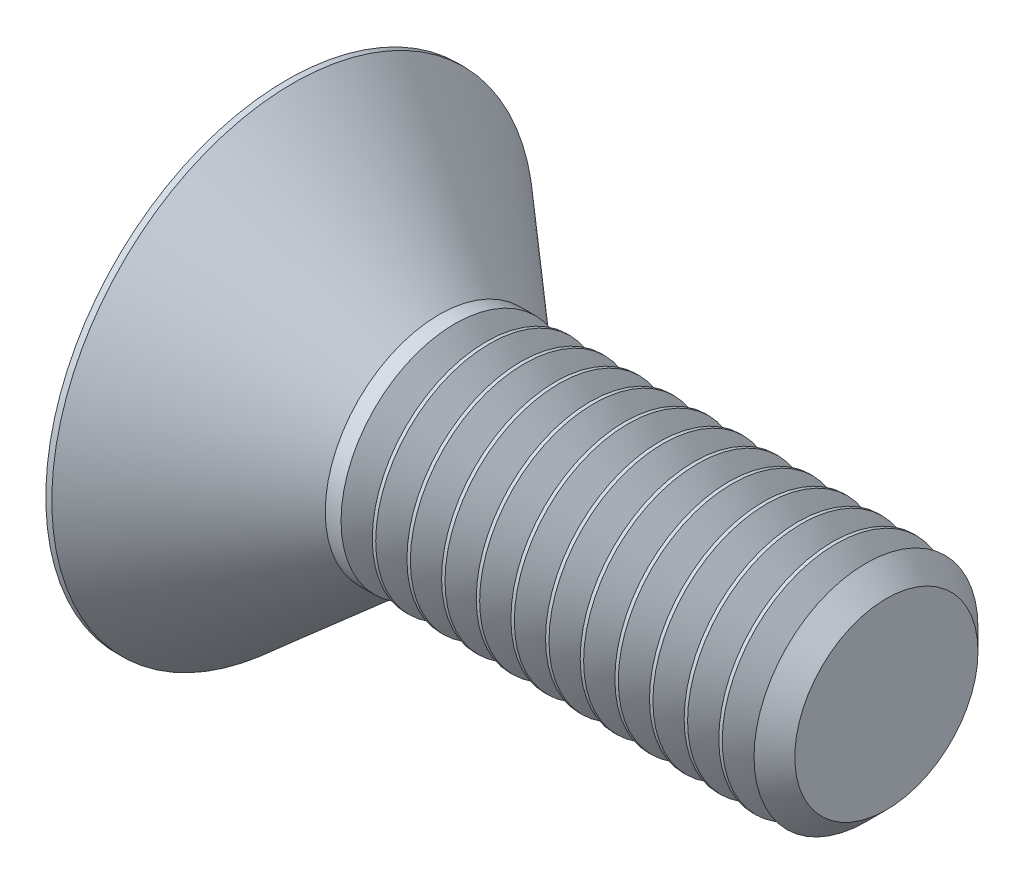
ISO-10303-21;
HEADER;
FILE_DESCRIPTION(('STEP AP214'),'2;1');
FILE_NAME('part.step','',(''),(''),'','','');
FILE_SCHEMA(('AUTOMOTIVE_DESIGN { 1 0 10303 214 1 1 1 1 }'));
ENDSEC;
DATA;
#1=APPLICATION_CONTEXT('core data for automotive mechanical design processes');
#2=APPLICATION_PROTOCOL_DEFINITION('international standard','automotive_design',2000,#1);
#3=PRODUCT_CONTEXT('',#1,'mechanical');
#4=PRODUCT('Part','Part','',(#3));
#5=PRODUCT_RELATED_PRODUCT_CATEGORY('part','',(#4));
#6=PRODUCT_DEFINITION_FORMATION('','',#4);
#7=PRODUCT_DEFINITION_CONTEXT('part definition',#1,'design');
#8=PRODUCT_DEFINITION('design','',#6,#7);
#9=PRODUCT_DEFINITION_SHAPE('','',#8);
#10=(LENGTH_UNIT() NAMED_UNIT(*) SI_UNIT(.MILLI.,.METRE.));
#11=(NAMED_UNIT(*) PLANE_ANGLE_UNIT() SI_UNIT($,.RADIAN.));
#12=(NAMED_UNIT(*) SI_UNIT($,.STERADIAN.) SOLID_ANGLE_UNIT());
#13=UNCERTAINTY_MEASURE_WITH_UNIT(LENGTH_MEASURE(1.E-05),#10,'distance_accuracy_value','');
#14=(GEOMETRIC_REPRESENTATION_CONTEXT(3) GLOBAL_UNCERTAINTY_ASSIGNED_CONTEXT((#13)) GLOBAL_UNIT_ASSIGNED_CONTEXT((#10,
#11,#12)) REPRESENTATION_CONTEXT('',''));
#15=CARTESIAN_POINT('',(0.,0.,0.));
#16=DIRECTION('',(0.,0.,1.));
#17=DIRECTION('',(1.,0.,0.));
#18=AXIS2_PLACEMENT_3D('',#15,#16,#17);
#19=CARTESIAN_POINT('',(2.2098,0.,0.));
#20=DIRECTION('',(-1.,0.,0.));
#21=DIRECTION('',(0.,0.,1.));
#22=AXIS2_PLACEMENT_3D('',#19,#20,#21);
#23=PLANE('',#22);
#24=DIRECTION('',(0.,-1.,0.));
#25=VECTOR('',#24,1.);
#26=CARTESIAN_POINT('',(2.2098,0.916543552338531,-1.5875));
#27=LINE('',#26,#25);
#28=CARTESIAN_POINT('',(2.2098,0.916543552338531,-1.5875));
#29=VERTEX_POINT('',#28);
#30=CARTESIAN_POINT('',(2.20980000040584,0.,-1.5875));
#31=VERTEX_POINT('',#30);
#32=EDGE_CURVE('E157',#29,#31,#27,.T.);
#33=ORIENTED_EDGE('',*,*,#32,.T.);
#34=CARTESIAN_POINT('',(2.20980000040584,0.,0.));
#35=DIRECTION('',(1.,0.,0.));
#36=DIRECTION('',(0.,0.,-1.));
#37=AXIS2_PLACEMENT_3D('',#34,#35,#36);
#38=CIRCLE('',#37,1.58750000019488);
#39=CARTESIAN_POINT('',(2.20980000040584,1.37481532867657,-0.793750000097439));
#40=VERTEX_POINT('',#39);
#41=EDGE_CURVE('E46',#31,#40,#38,.T.);
#42=ORIENTED_EDGE('',*,*,#41,.T.);
#43=DIRECTION('',(0.,-0.5,-0.866025403784439));
#44=VECTOR('',#43,1.);
#45=CARTESIAN_POINT('',(2.2098,1.83308710467706,0.));
#46=LINE('',#45,#44);
#47=EDGE_CURVE('E319',#40,#29,#46,.T.);
#48=ORIENTED_EDGE('',*,*,#47,.T.);
#49=EDGE_LOOP('',(#33,#42,#48));
#50=FACE_BOUND('',#49,.T.);
#51=ADVANCED_FACE('F35',(#50),#23,.T.);
#52=CARTESIAN_POINT('',(2.2098,1.83308710467706,0.));
#53=VERTEX_POINT('',#52);
#54=EDGE_CURVE('E324',#53,#40,#46,.T.);
#55=ORIENTED_EDGE('',*,*,#54,.T.);
#56=CARTESIAN_POINT('',(2.20980000040584,1.37481532867657,0.793750000097439));
#57=VERTEX_POINT('',#56);
#58=EDGE_CURVE('E11',#40,#57,#38,.T.);
#59=ORIENTED_EDGE('',*,*,#58,.T.);
#60=DIRECTION('',(0.,0.5,-0.866025403784439));
#61=VECTOR('',#60,1.);
#62=CARTESIAN_POINT('',(2.2098,0.916543552338531,1.5875));
#63=LINE('',#62,#61);
#64=EDGE_CURVE('E183',#57,#53,#63,.T.);
#65=ORIENTED_EDGE('',*,*,#64,.T.);
#66=EDGE_LOOP('',(#55,#59,#65));
#67=FACE_BOUND('',#66,.T.);
#68=ADVANCED_FACE('F122',(#67),#23,.T.);
#69=CARTESIAN_POINT('',(2.2098,0.916543552338531,1.5875));
#70=VERTEX_POINT('',#69);
#71=EDGE_CURVE('E325',#70,#57,#63,.T.);
#72=ORIENTED_EDGE('',*,*,#71,.T.);
#73=CARTESIAN_POINT('',(2.20980000040584,0.,1.58750000019488));
#74=VERTEX_POINT('',#73);
#75=EDGE_CURVE('E44',#57,#74,#38,.T.);
#76=ORIENTED_EDGE('',*,*,#75,.T.);
#77=DIRECTION('',(0.,1.,0.));
#78=VECTOR('',#77,1.);
#79=CARTESIAN_POINT('',(2.2098,-0.91654355233853,1.5875));
#80=LINE('',#79,#78);
#81=EDGE_CURVE('E162',#74,#70,#80,.T.);
#82=ORIENTED_EDGE('',*,*,#81,.T.);
#83=EDGE_LOOP('',(#72,#76,#82));
#84=FACE_BOUND('',#83,.T.);
#85=ADVANCED_FACE('F128',(#84),#23,.T.);
#86=CARTESIAN_POINT('',(2.2098,-0.91654355233853,1.5875));
#87=VERTEX_POINT('',#86);
#88=EDGE_CURVE('E163',#87,#74,#80,.T.);
#89=ORIENTED_EDGE('',*,*,#88,.T.);
#90=CARTESIAN_POINT('',(2.20980000040584,-1.37481532867657,0.793750000097439));
#91=VERTEX_POINT('',#90);
#92=EDGE_CURVE('E316',#74,#91,#38,.T.);
#93=ORIENTED_EDGE('',*,*,#92,.T.);
#94=DIRECTION('',(0.,0.5,0.866025403784439));
#95=VECTOR('',#94,1.);
#96=CARTESIAN_POINT('',(2.2098,-1.83308710467706,0.));
#97=LINE('',#96,#95);
#98=EDGE_CURVE('E152',#91,#87,#97,.T.);
#99=ORIENTED_EDGE('',*,*,#98,.T.);
#100=EDGE_LOOP('',(#89,#93,#99));
#101=FACE_BOUND('',#100,.T.);
#102=ADVANCED_FACE('F141',(#101),#23,.T.);
#103=CARTESIAN_POINT('',(2.2098,-1.83308710467706,0.));
#104=VERTEX_POINT('',#103);
#105=EDGE_CURVE('E155',#104,#91,#97,.T.);
#106=ORIENTED_EDGE('',*,*,#105,.T.);
#107=CARTESIAN_POINT('',(2.20980000040584,-1.37481532867657,-0.793750000097439));
#108=VERTEX_POINT('',#107);
#109=EDGE_CURVE('E314',#91,#108,#38,.T.);
#110=ORIENTED_EDGE('',*,*,#109,.T.);
#111=DIRECTION('',(0.,-0.5,0.866025403784439));
#112=VECTOR('',#111,1.);
#113=CARTESIAN_POINT('',(2.2098,-0.91654355233853,-1.5875));
#114=LINE('',#113,#112);
#115=EDGE_CURVE('E153',#108,#104,#114,.T.);
#116=ORIENTED_EDGE('',*,*,#115,.T.);
#117=EDGE_LOOP('',(#106,#110,#116));
#118=FACE_BOUND('',#117,.T.);
#119=ADVANCED_FACE('F133',(#118),#23,.T.);
#120=CARTESIAN_POINT('',(2.2098,-0.91654355233853,-1.5875));
#121=VERTEX_POINT('',#120);
#122=EDGE_CURVE('E145',#121,#108,#114,.T.);
#123=ORIENTED_EDGE('',*,*,#122,.T.);
#124=EDGE_CURVE('E146',#108,#31,#38,.T.);
#125=ORIENTED_EDGE('',*,*,#124,.T.);
#126=EDGE_CURVE('E148',#31,#121,#27,.T.);
#127=ORIENTED_EDGE('',*,*,#126,.T.);
#128=EDGE_LOOP('',(#123,#125,#127));
#129=FACE_BOUND('',#128,.T.);
#130=ADVANCED_FACE('F124',(#129),#23,.T.);
#131=CARTESIAN_POINT('',(0.,6.68201751571258E-11,0.));
#132=DIRECTION('',(1.,0.,0.));
#133=DIRECTION('',(0.,0.,-1.));
#134=AXIS2_PLACEMENT_3D('',#131,#132,#133);
#135=CYLINDRICAL_SURFACE('',#134,5.10667);
#136=CARTESIAN_POINT('',(0.,6.68201751571258E-11,0.));
#137=DIRECTION('',(1.,0.,0.));
#138=DIRECTION('',(0.,0.,-1.));
#139=AXIS2_PLACEMENT_3D('',#136,#137,#138);
#140=CIRCLE('',#139,5.10667);
#141=CARTESIAN_POINT('',(0.,6.68201751571258E-11,-5.10667));
#142=VERTEX_POINT('',#141);
#143=EDGE_CURVE('E39',#142,#142,#140,.T.);
#144=ORIENTED_EDGE('',*,*,#143,.T.);
#145=EDGE_LOOP('',(#144));
#146=FACE_BOUND('',#145,.T.);
#147=CARTESIAN_POINT('',(0.127,6.68201751571258E-11,0.));
#148=DIRECTION('',(1.,0.,0.));
#149=DIRECTION('',(0.,0.,-1.));
#150=AXIS2_PLACEMENT_3D('',#147,#148,#149);
#151=CIRCLE('',#150,5.10667);
#152=CARTESIAN_POINT('',(0.127,6.68201751571258E-11,-5.10667));
#153=VERTEX_POINT('',#152);
#154=EDGE_CURVE('E186',#153,#153,#151,.T.);
#155=ORIENTED_EDGE('',*,*,#154,.F.);
#156=EDGE_LOOP('',(#155));
#157=FACE_BOUND('',#156,.T.);
#158=ADVANCED_FACE('F37',(#146,#157),#135,.T.);
#159=CARTESIAN_POINT('',(0.,5.10667000006682,0.));
#160=DIRECTION('',(-1.,0.,0.));
#161=DIRECTION('',(0.,0.,1.));
#162=AXIS2_PLACEMENT_3D('',#159,#160,#161);
#163=PLANE('',#162);
#164=DIRECTION('',(0.,0.5,-0.866025403784439));
#165=VECTOR('',#164,1.);
#166=CARTESIAN_POINT('',(0.,0.916543552338531,1.5875));
#167=LINE('',#166,#165);
#168=CARTESIAN_POINT('',(0.,0.916543552338531,1.5875));
#169=VERTEX_POINT('',#168);
#170=CARTESIAN_POINT('',(0.,1.83308710467706,0.));
#171=VERTEX_POINT('',#170);
#172=EDGE_CURVE('E60',#169,#171,#167,.T.);
#173=ORIENTED_EDGE('',*,*,#172,.F.);
#174=DIRECTION('',(0.,1.,0.));
#175=VECTOR('',#174,1.);
#176=CARTESIAN_POINT('',(0.,-0.91654355233853,1.5875));
#177=LINE('',#176,#175);
#178=CARTESIAN_POINT('',(0.,-0.91654355233853,1.5875));
#179=VERTEX_POINT('',#178);
#180=EDGE_CURVE('E180',#179,#169,#177,.T.);
#181=ORIENTED_EDGE('',*,*,#180,.F.);
#182=DIRECTION('',(0.,0.5,0.866025403784439));
#183=VECTOR('',#182,1.);
#184=CARTESIAN_POINT('',(0.,-1.83308710467706,0.));
#185=LINE('',#184,#183);
#186=CARTESIAN_POINT('',(0.,-1.83308710467706,0.));
#187=VERTEX_POINT('',#186);
#188=EDGE_CURVE('E177',#187,#179,#185,.T.);
#189=ORIENTED_EDGE('',*,*,#188,.F.);
#190=DIRECTION('',(0.,-0.5,0.866025403784439));
#191=VECTOR('',#190,1.);
#192=CARTESIAN_POINT('',(0.,-0.91654355233853,-1.5875));
#193=LINE('',#192,#191);
#194=CARTESIAN_POINT('',(0.,-0.91654355233853,-1.5875));
#195=VERTEX_POINT('',#194);
#196=EDGE_CURVE('E174',#195,#187,#193,.T.);
#197=ORIENTED_EDGE('',*,*,#196,.F.);
#198=DIRECTION('',(0.,-1.,0.));
#199=VECTOR('',#198,1.);
#200=CARTESIAN_POINT('',(0.,0.916543552338531,-1.5875));
#201=LINE('',#200,#199);
#202=CARTESIAN_POINT('',(0.,0.916543552338531,-1.5875));
#203=VERTEX_POINT('',#202);
#204=EDGE_CURVE('E171',#203,#195,#201,.T.);
#205=ORIENTED_EDGE('',*,*,#204,.F.);
#206=DIRECTION('',(0.,-0.5,-0.866025403784439));
#207=VECTOR('',#206,1.);
#208=CARTESIAN_POINT('',(0.,1.83308710467706,0.));
#209=LINE('',#208,#207);
#210=EDGE_CURVE('E168',#171,#203,#209,.T.);
#211=ORIENTED_EDGE('',*,*,#210,.F.);
#212=EDGE_LOOP('',(#173,#181,#189,#197,#205,#211));
#213=FACE_BOUND('',#212,.T.);
#214=ORIENTED_EDGE('',*,*,#143,.F.);
#215=EDGE_LOOP('',(#214));
#216=FACE_BOUND('',#215,.T.);
#217=ADVANCED_FACE('F139',(#213,#216),#163,.T.);
#218=CARTESIAN_POINT('',(12.6999999999782,6.68201751571258E-11,0.));
#219=DIRECTION('',(1.,0.,0.));
#220=DIRECTION('',(0.,0.,-1.));
#221=AXIS2_PLACEMENT_3D('',#218,#219,#220);
#222=PLANE('',#221);
#223=CARTESIAN_POINT('',(12.6999999999782,6.68201751571258E-11,0.));
#224=DIRECTION('',(1.,0.,0.));
#225=DIRECTION('',(0.,0.,-1.));
#226=AXIS2_PLACEMENT_3D('',#223,#224,#225);
#227=CIRCLE('',#226,1.94055999995298);
#228=CARTESIAN_POINT('',(12.6999999999782,6.68201751571258E-11,-1.94055999995298));
#229=VERTEX_POINT('',#228);
#230=EDGE_CURVE('E308',#229,#229,#227,.T.);
#231=ORIENTED_EDGE('',*,*,#230,.T.);
#232=EDGE_LOOP('',(#231));
#233=FACE_BOUND('',#232,.T.);
#234=ADVANCED_FACE('F517',(#233),#222,.T.);
#235=CARTESIAN_POINT('',(12.6999999999782,6.68201751571258E-11,0.));
#236=DIRECTION('',(-1.,0.,0.));
#237=DIRECTION('',(0.,0.,1.));
#238=AXIS2_PLACEMENT_3D('',#235,#236,#237);
#239=CONICAL_SURFACE('',#238,1.94055999995298,0.785398163397448);
#240=CARTESIAN_POINT('',(12.2682633834984,6.68201751571258E-11,0.));
#241=DIRECTION('',(1.,0.,0.));
#242=DIRECTION('',(0.,0.,-1.));
#243=AXIS2_PLACEMENT_3D('',#240,#241,#242);
#244=CIRCLE('',#243,2.3722966164328);
#245=CARTESIAN_POINT('',(12.2682633834984,6.68201751571258E-11,-2.3722966164328));
#246=VERTEX_POINT('',#245);
#247=EDGE_CURVE('E306',#246,#246,#244,.T.);
#248=ORIENTED_EDGE('',*,*,#247,.T.);
#249=EDGE_LOOP('',(#248));
#250=FACE_BOUND('',#249,.T.);
#251=ORIENTED_EDGE('',*,*,#230,.F.);
#252=EDGE_LOOP('',(#251));
#253=FACE_BOUND('',#252,.T.);
#254=ADVANCED_FACE('F513',(#250,#253),#239,.T.);
#255=CARTESIAN_POINT('',(12.2682633834984,6.68201751571258E-11,0.));
#256=DIRECTION('',(1.,0.,0.));
#257=DIRECTION('',(0.,0.,-1.));
#258=AXIS2_PLACEMENT_3D('',#255,#256,#257);
#259=CONICAL_SURFACE('',#258,2.3722966164328,0.959931088589569);
#260=CARTESIAN_POINT('',(11.9659581500855,6.68201751571258E-11,0.));
#261=DIRECTION('',(1.,0.,0.));
#262=DIRECTION('',(0.,0.,-1.));
#263=AXIS2_PLACEMENT_3D('',#260,#261,#262);
#264=CIRCLE('',#263,1.94055999991318);
#265=CARTESIAN_POINT('',(11.9659581500855,6.68201751571258E-11,-1.94055999991318));
#266=VERTEX_POINT('',#265);
#267=EDGE_CURVE('E303',#266,#266,#264,.T.);
#268=ORIENTED_EDGE('',*,*,#267,.T.);
#269=EDGE_LOOP('',(#268));
#270=FACE_BOUND('',#269,.T.);
#271=ORIENTED_EDGE('',*,*,#247,.F.);
#272=EDGE_LOOP('',(#271));
#273=FACE_BOUND('',#272,.T.);
#274=ADVANCED_FACE('F509',(#270,#273),#259,.T.);
#275=CARTESIAN_POINT('',(11.9659581500855,6.68201751571258E-11,0.));
#276=DIRECTION('',(-1.,0.,0.));
#277=DIRECTION('',(0.,0.,1.));
#278=AXIS2_PLACEMENT_3D('',#275,#276,#277);
#279=CONICAL_SURFACE('',#278,1.94055999991318,0.959931088600903);
#280=CARTESIAN_POINT('',(11.6351521007225,6.68201751571258E-11,0.));
#281=DIRECTION('',(1.,0.,0.));
#282=DIRECTION('',(0.,0.,-1.));
#283=AXIS2_PLACEMENT_3D('',#280,#281,#282);
#284=CIRCLE('',#283,2.41299999993316);
#285=CARTESIAN_POINT('',(11.6351521007225,6.68201751571258E-11,-2.41299999993316));
#286=VERTEX_POINT('',#285);
#287=EDGE_CURVE('E300',#286,#286,#284,.T.);
#288=ORIENTED_EDGE('',*,*,#287,.T.);
#289=EDGE_LOOP('',(#288));
#290=FACE_BOUND('',#289,.T.);
#291=ORIENTED_EDGE('',*,*,#267,.F.);
#292=EDGE_LOOP('',(#291));
#293=FACE_BOUND('',#292,.T.);
#294=ADVANCED_FACE('F505',(#290,#293),#279,.T.);
#295=CARTESIAN_POINT('',(0.,6.68201751571258E-11,0.));
#296=DIRECTION('',(1.,0.,0.));
#297=DIRECTION('',(0.,0.,-1.));
#298=AXIS2_PLACEMENT_3D('',#295,#296,#297);
#299=CYLINDRICAL_SURFACE('',#298,2.41299999993316);
#300=CARTESIAN_POINT('',(11.5626969495111,6.68201751571258E-11,0.));
#301=DIRECTION('',(1.,0.,0.));
#302=DIRECTION('',(0.,0.,-1.));
#303=AXIS2_PLACEMENT_3D('',#300,#301,#302);
#304=CIRCLE('',#303,2.41299999993316);
#305=CARTESIAN_POINT('',(11.5626969495111,6.68201751571258E-11,-2.41299999993316));
#306=VERTEX_POINT('',#305);
#307=EDGE_CURVE('E297',#306,#306,#304,.T.);
#308=ORIENTED_EDGE('',*,*,#307,.T.);
#309=EDGE_LOOP('',(#308));
#310=FACE_BOUND('',#309,.T.);
#311=ORIENTED_EDGE('',*,*,#287,.F.);
#312=EDGE_LOOP('',(#311));
#313=FACE_BOUND('',#312,.T.);
#314=ADVANCED_FACE('F501',(#310,#313),#299,.T.);
#315=CARTESIAN_POINT('',(11.5626969495111,6.68201751571258E-11,0.));
#316=DIRECTION('',(1.,0.,0.));
#317=DIRECTION('',(0.,0.,-1.));
#318=AXIS2_PLACEMENT_3D('',#315,#316,#317);
#319=CONICAL_SURFACE('',#318,2.41299999993316,0.959931088601825);
#320=CARTESIAN_POINT('',(11.2318909001488,6.68201751571258E-11,0.));
#321=DIRECTION('',(1.,0.,0.));
#322=DIRECTION('',(0.,0.,-1.));
#323=AXIS2_PLACEMENT_3D('',#320,#321,#322);
#324=CIRCLE('',#323,1.94055999991318);
#325=CARTESIAN_POINT('',(11.2318909001488,6.68201751571258E-11,-1.94055999991318));
#326=VERTEX_POINT('',#325);
#327=EDGE_CURVE('E294',#326,#326,#324,.T.);
#328=ORIENTED_EDGE('',*,*,#327,.T.);
#329=EDGE_LOOP('',(#328));
#330=FACE_BOUND('',#329,.T.);
#331=ORIENTED_EDGE('',*,*,#307,.F.);
#332=EDGE_LOOP('',(#331));
#333=FACE_BOUND('',#332,.T.);
#334=ADVANCED_FACE('F497',(#330,#333),#319,.T.);
#335=CARTESIAN_POINT('',(11.2318909001488,6.68201751571258E-11,0.));
#336=DIRECTION('',(-1.,0.,0.));
#337=DIRECTION('',(0.,0.,1.));
#338=AXIS2_PLACEMENT_3D('',#335,#336,#337);
#339=CONICAL_SURFACE('',#338,1.94055999991318,0.959931088616647);
#340=CARTESIAN_POINT('',(10.9010848507969,6.68201751571258E-11,0.));
#341=DIRECTION('',(1.,0.,0.));
#342=DIRECTION('',(0.,0.,-1.));
#343=AXIS2_PLACEMENT_3D('',#340,#341,#342);
#344=CIRCLE('',#343,2.41299999993316);
#345=CARTESIAN_POINT('',(10.9010848507969,6.68201751571258E-11,-2.41299999993316));
#346=VERTEX_POINT('',#345);
#347=EDGE_CURVE('E291',#346,#346,#344,.T.);
#348=ORIENTED_EDGE('',*,*,#347,.T.);
#349=EDGE_LOOP('',(#348));
#350=FACE_BOUND('',#349,.T.);
#351=ORIENTED_EDGE('',*,*,#327,.F.);
#352=EDGE_LOOP('',(#351));
#353=FACE_BOUND('',#352,.T.);
#354=ADVANCED_FACE('F493',(#350,#353),#339,.T.);
#355=CARTESIAN_POINT('',(0.,6.68201751571258E-11,0.));
#356=DIRECTION('',(1.,0.,0.));
#357=DIRECTION('',(0.,0.,-1.));
#358=AXIS2_PLACEMENT_3D('',#355,#356,#357);
#359=CYLINDRICAL_SURFACE('',#358,2.41299999993316);
#360=CARTESIAN_POINT('',(10.8286296995743,6.68201751571258E-11,0.));
#361=DIRECTION('',(1.,0.,0.));
#362=DIRECTION('',(0.,0.,-1.));
#363=AXIS2_PLACEMENT_3D('',#360,#361,#362);
#364=CIRCLE('',#363,2.41299999993316);
#365=CARTESIAN_POINT('',(10.8286296995743,6.68201751571258E-11,-2.41299999993316));
#366=VERTEX_POINT('',#365);
#367=EDGE_CURVE('E288',#366,#366,#364,.T.);
#368=ORIENTED_EDGE('',*,*,#367,.T.);
#369=EDGE_LOOP('',(#368));
#370=FACE_BOUND('',#369,.T.);
#371=ORIENTED_EDGE('',*,*,#347,.F.);
#372=EDGE_LOOP('',(#371));
#373=FACE_BOUND('',#372,.T.);
#374=ADVANCED_FACE('F489',(#370,#373),#359,.T.);
#375=CARTESIAN_POINT('',(10.8286296995743,6.68201751571258E-11,0.));
#376=DIRECTION('',(1.,0.,0.));
#377=DIRECTION('',(0.,0.,-1.));
#378=AXIS2_PLACEMENT_3D('',#375,#376,#377);
#379=CONICAL_SURFACE('',#378,2.41299999993316,0.959931088601825);
#380=CARTESIAN_POINT('',(10.497823650212,6.68201751571258E-11,0.));
#381=DIRECTION('',(1.,0.,0.));
#382=DIRECTION('',(0.,0.,-1.));
#383=AXIS2_PLACEMENT_3D('',#380,#381,#382);
#384=CIRCLE('',#383,1.94055999991318);
#385=CARTESIAN_POINT('',(10.497823650212,6.68201751571258E-11,-1.94055999991318));
#386=VERTEX_POINT('',#385);
#387=EDGE_CURVE('E285',#386,#386,#384,.T.);
#388=ORIENTED_EDGE('',*,*,#387,.T.);
#389=EDGE_LOOP('',(#388));
#390=FACE_BOUND('',#389,.T.);
#391=ORIENTED_EDGE('',*,*,#367,.F.);
#392=EDGE_LOOP('',(#391));
#393=FACE_BOUND('',#392,.T.);
#394=ADVANCED_FACE('F485',(#390,#393),#379,.T.);
#395=CARTESIAN_POINT('',(10.497823650212,6.68201751571258E-11,0.));
#396=DIRECTION('',(-1.,0.,0.));
#397=DIRECTION('',(0.,0.,1.));
#398=AXIS2_PLACEMENT_3D('',#395,#396,#397);
#399=CONICAL_SURFACE('',#398,1.94055999991318,0.959931088632391);
#400=CARTESIAN_POINT('',(10.1670176008712,6.68201751571258E-11,0.));
#401=DIRECTION('',(1.,0.,0.));
#402=DIRECTION('',(0.,0.,-1.));
#403=AXIS2_PLACEMENT_3D('',#400,#401,#402);
#404=CIRCLE('',#403,2.41299999993316);
#405=CARTESIAN_POINT('',(10.1670176008712,6.68201751571258E-11,-2.41299999993316));
#406=VERTEX_POINT('',#405);
#407=EDGE_CURVE('E282',#406,#406,#404,.T.);
#408=ORIENTED_EDGE('',*,*,#407,.T.);
#409=EDGE_LOOP('',(#408));
#410=FACE_BOUND('',#409,.T.);
#411=ORIENTED_EDGE('',*,*,#387,.F.);
#412=EDGE_LOOP('',(#411));
#413=FACE_BOUND('',#412,.T.);
#414=ADVANCED_FACE('F481',(#410,#413),#399,.T.);
#415=CARTESIAN_POINT('',(0.,6.68201751571258E-11,0.));
#416=DIRECTION('',(1.,0.,0.));
#417=DIRECTION('',(0.,0.,-1.));
#418=AXIS2_PLACEMENT_3D('',#415,#416,#417);
#419=CYLINDRICAL_SURFACE('',#418,2.41299999993316);
#420=CARTESIAN_POINT('',(10.0945624496376,6.68201751571258E-11,0.));
#421=DIRECTION('',(1.,0.,0.));
#422=DIRECTION('',(0.,0.,-1.));
#423=AXIS2_PLACEMENT_3D('',#420,#421,#422);
#424=CIRCLE('',#423,2.41299999993316);
#425=CARTESIAN_POINT('',(10.0945624496376,6.68201751571258E-11,-2.41299999993316));
#426=VERTEX_POINT('',#425);
#427=EDGE_CURVE('E279',#426,#426,#424,.T.);
#428=ORIENTED_EDGE('',*,*,#427,.T.);
#429=EDGE_LOOP('',(#428));
#430=FACE_BOUND('',#429,.T.);
#431=ORIENTED_EDGE('',*,*,#407,.F.);
#432=EDGE_LOOP('',(#431));
#433=FACE_BOUND('',#432,.T.);
#434=ADVANCED_FACE('F477',(#430,#433),#419,.T.);
#435=CARTESIAN_POINT('',(10.0945624496376,6.68201751571258E-11,0.));
#436=DIRECTION('',(1.,0.,0.));
#437=DIRECTION('',(0.,0.,-1.));
#438=AXIS2_PLACEMENT_3D('',#435,#436,#437);
#439=CONICAL_SURFACE('',#438,2.41299999993316,0.959931088601825);
#440=CARTESIAN_POINT('',(9.76375640027527,6.68201751571258E-11,0.));
#441=DIRECTION('',(1.,0.,0.));
#442=DIRECTION('',(0.,0.,-1.));
#443=AXIS2_PLACEMENT_3D('',#440,#441,#442);
#444=CIRCLE('',#443,1.94055999991318);
#445=CARTESIAN_POINT('',(9.76375640027527,6.68201751571258E-11,-1.94055999991318));
#446=VERTEX_POINT('',#445);
#447=EDGE_CURVE('E276',#446,#446,#444,.T.);
#448=ORIENTED_EDGE('',*,*,#447,.T.);
#449=EDGE_LOOP('',(#448));
#450=FACE_BOUND('',#449,.T.);
#451=ORIENTED_EDGE('',*,*,#427,.F.);
#452=EDGE_LOOP('',(#451));
#453=FACE_BOUND('',#452,.T.);
#454=ADVANCED_FACE('F473',(#450,#453),#439,.T.);
#455=CARTESIAN_POINT('',(9.76375640027527,6.68201751571258E-11,0.));
#456=DIRECTION('',(-1.,0.,0.));
#457=DIRECTION('',(0.,0.,1.));
#458=AXIS2_PLACEMENT_3D('',#455,#456,#457);
#459=CONICAL_SURFACE('',#458,1.94055999991318,0.959931088648134);
#460=CARTESIAN_POINT('',(9.43295035094557,6.68201751571258E-11,0.));
#461=DIRECTION('',(1.,0.,0.));
#462=DIRECTION('',(0.,0.,-1.));
#463=AXIS2_PLACEMENT_3D('',#460,#461,#462);
#464=CIRCLE('',#463,2.41299999993316);
#465=CARTESIAN_POINT('',(9.43295035094557,6.68201751571258E-11,-2.41299999993316));
#466=VERTEX_POINT('',#465);
#467=EDGE_CURVE('E273',#466,#466,#464,.T.);
#468=ORIENTED_EDGE('',*,*,#467,.T.);
#469=EDGE_LOOP('',(#468));
#470=FACE_BOUND('',#469,.T.);
#471=ORIENTED_EDGE('',*,*,#447,.F.);
#472=EDGE_LOOP('',(#471));
#473=FACE_BOUND('',#472,.T.);
#474=ADVANCED_FACE('F469',(#470,#473),#459,.T.);
#475=CARTESIAN_POINT('',(0.,6.68201751571258E-11,0.));
#476=DIRECTION('',(1.,0.,0.));
#477=DIRECTION('',(0.,0.,-1.));
#478=AXIS2_PLACEMENT_3D('',#475,#476,#477);
#479=CYLINDRICAL_SURFACE('',#478,2.41299999993316);
#480=CARTESIAN_POINT('',(9.36049519975768,6.68201751571258E-11,0.));
#481=DIRECTION('',(1.,0.,0.));
#482=DIRECTION('',(0.,0.,-1.));
#483=AXIS2_PLACEMENT_3D('',#480,#481,#482);
#484=CIRCLE('',#483,2.41299999993316);
#485=CARTESIAN_POINT('',(9.36049519975768,6.68201751571258E-11,-2.41299999993316));
#486=VERTEX_POINT('',#485);
#487=EDGE_CURVE('E270',#486,#486,#484,.T.);
#488=ORIENTED_EDGE('',*,*,#487,.T.);
#489=EDGE_LOOP('',(#488));
#490=FACE_BOUND('',#489,.T.);
#491=ORIENTED_EDGE('',*,*,#467,.F.);
#492=EDGE_LOOP('',(#491));
#493=FACE_BOUND('',#492,.T.);
#494=ADVANCED_FACE('F465',(#490,#493),#479,.T.);
#495=CARTESIAN_POINT('',(9.36049519975768,6.68201751571258E-11,0.));
#496=DIRECTION('',(1.,0.,0.));
#497=DIRECTION('',(0.,0.,-1.));
#498=AXIS2_PLACEMENT_3D('',#495,#496,#497);
#499=CONICAL_SURFACE('',#498,2.41299999993316,0.959931088601825);
#500=CARTESIAN_POINT('',(9.02968915039537,6.68201751571258E-11,0.));
#501=DIRECTION('',(1.,0.,0.));
#502=DIRECTION('',(0.,0.,-1.));
#503=AXIS2_PLACEMENT_3D('',#500,#501,#502);
#504=CIRCLE('',#503,1.94055999991318);
#505=CARTESIAN_POINT('',(9.02968915039537,6.68201751571258E-11,-1.94055999991318));
#506=VERTEX_POINT('',#505);
#507=EDGE_CURVE('E267',#506,#506,#504,.T.);
#508=ORIENTED_EDGE('',*,*,#507,.T.);
#509=EDGE_LOOP('',(#508));
#510=FACE_BOUND('',#509,.T.);
#511=ORIENTED_EDGE('',*,*,#487,.F.);
#512=EDGE_LOOP('',(#511));
#513=FACE_BOUND('',#512,.T.);
#514=ADVANCED_FACE('F461',(#510,#513),#499,.T.);
#515=CARTESIAN_POINT('',(9.02968915039537,6.68201751571258E-11,0.));
#516=DIRECTION('',(-1.,0.,0.));
#517=DIRECTION('',(0.,0.,1.));
#518=AXIS2_PLACEMENT_3D('',#515,#516,#517);
#519=CONICAL_SURFACE('',#518,1.94055999991318,0.959931088583141);
#520=CARTESIAN_POINT('',(8.69888310101991,6.68201751571258E-11,0.));
#521=DIRECTION('',(1.,0.,0.));
#522=DIRECTION('',(0.,0.,-1.));
#523=AXIS2_PLACEMENT_3D('',#520,#521,#522);
#524=CIRCLE('',#523,2.41299999993316);
#525=CARTESIAN_POINT('',(8.69888310101991,6.68201751571258E-11,-2.41299999993316));
#526=VERTEX_POINT('',#525);
#527=EDGE_CURVE('E264',#526,#526,#524,.T.);
#528=ORIENTED_EDGE('',*,*,#527,.T.);
#529=EDGE_LOOP('',(#528));
#530=FACE_BOUND('',#529,.T.);
#531=ORIENTED_EDGE('',*,*,#507,.F.);
#532=EDGE_LOOP('',(#531));
#533=FACE_BOUND('',#532,.T.);
#534=ADVANCED_FACE('F457',(#530,#533),#519,.T.);
#535=CARTESIAN_POINT('',(0.,6.68201751571258E-11,0.));
#536=DIRECTION('',(1.,0.,0.));
#537=DIRECTION('',(0.,0.,-1.));
#538=AXIS2_PLACEMENT_3D('',#535,#536,#537);
#539=CYLINDRICAL_SURFACE('',#538,2.41299999993316);
#540=CARTESIAN_POINT('',(8.62642794982094,6.68201751571258E-11,0.));
#541=DIRECTION('',(1.,0.,0.));
#542=DIRECTION('',(0.,0.,-1.));
#543=AXIS2_PLACEMENT_3D('',#540,#541,#542);
#544=CIRCLE('',#543,2.41299999993316);
#545=CARTESIAN_POINT('',(8.62642794982094,6.68201751571258E-11,-2.41299999993316));
#546=VERTEX_POINT('',#545);
#547=EDGE_CURVE('E261',#546,#546,#544,.T.);
#548=ORIENTED_EDGE('',*,*,#547,.T.);
#549=EDGE_LOOP('',(#548));
#550=FACE_BOUND('',#549,.T.);
#551=ORIENTED_EDGE('',*,*,#527,.F.);
#552=EDGE_LOOP('',(#551));
#553=FACE_BOUND('',#552,.T.);
#554=ADVANCED_FACE('F453',(#550,#553),#539,.T.);
#555=CARTESIAN_POINT('',(8.62642794982094,6.68201751571258E-11,0.));
#556=DIRECTION('',(1.,0.,0.));
#557=DIRECTION('',(0.,0.,-1.));
#558=AXIS2_PLACEMENT_3D('',#555,#556,#557);
#559=CONICAL_SURFACE('',#558,2.41299999993316,0.959931088601824);
#560=CARTESIAN_POINT('',(8.29562190045863,6.68201751571258E-11,0.));
#561=DIRECTION('',(1.,0.,0.));
#562=DIRECTION('',(0.,0.,-1.));
#563=AXIS2_PLACEMENT_3D('',#560,#561,#562);
#564=CIRCLE('',#563,1.94055999991318);
#565=CARTESIAN_POINT('',(8.29562190045863,6.68201751571258E-11,-1.94055999991318));
#566=VERTEX_POINT('',#565);
#567=EDGE_CURVE('E258',#566,#566,#564,.T.);
#568=ORIENTED_EDGE('',*,*,#567,.T.);
#569=EDGE_LOOP('',(#568));
#570=FACE_BOUND('',#569,.T.);
#571=ORIENTED_EDGE('',*,*,#547,.F.);
#572=EDGE_LOOP('',(#571));
#573=FACE_BOUND('',#572,.T.);
#574=ADVANCED_FACE('F449',(#570,#573),#559,.T.);
#575=CARTESIAN_POINT('',(8.29562190045863,6.68201751571258E-11,0.));
#576=DIRECTION('',(-1.,0.,0.));
#577=DIRECTION('',(0.,0.,1.));
#578=AXIS2_PLACEMENT_3D('',#575,#576,#577);
#579=CONICAL_SURFACE('',#578,1.94055999991318,0.959931088598884);
#580=CARTESIAN_POINT('',(7.96481585109425,6.68201751571258E-11,0.));
#581=DIRECTION('',(1.,0.,0.));
#582=DIRECTION('',(0.,0.,-1.));
#583=AXIS2_PLACEMENT_3D('',#580,#581,#582);
#584=CIRCLE('',#583,2.41299999993316);
#585=CARTESIAN_POINT('',(7.96481585109425,6.68201751571258E-11,-2.41299999993316));
#586=VERTEX_POINT('',#585);
#587=EDGE_CURVE('E255',#586,#586,#584,.T.);
#588=ORIENTED_EDGE('',*,*,#587,.T.);
#589=EDGE_LOOP('',(#588));
#590=FACE_BOUND('',#589,.T.);
#591=ORIENTED_EDGE('',*,*,#567,.F.);
#592=EDGE_LOOP('',(#591));
#593=FACE_BOUND('',#592,.T.);
#594=ADVANCED_FACE('F445',(#590,#593),#579,.T.);
#595=CARTESIAN_POINT('',(0.,6.68201751571258E-11,0.));
#596=DIRECTION('',(1.,0.,0.));
#597=DIRECTION('',(0.,0.,-1.));
#598=AXIS2_PLACEMENT_3D('',#595,#596,#597);
#599=CYLINDRICAL_SURFACE('',#598,2.41299999993316);
#600=CARTESIAN_POINT('',(7.89236069988419,6.68201751571258E-11,0.));
#601=DIRECTION('',(1.,0.,0.));
#602=DIRECTION('',(0.,0.,-1.));
#603=AXIS2_PLACEMENT_3D('',#600,#601,#602);
#604=CIRCLE('',#603,2.41299999993316);
#605=CARTESIAN_POINT('',(7.89236069988419,6.68201751571258E-11,-2.41299999993316));
#606=VERTEX_POINT('',#605);
#607=EDGE_CURVE('E252',#606,#606,#604,.T.);
#608=ORIENTED_EDGE('',*,*,#607,.T.);
#609=EDGE_LOOP('',(#608));
#610=FACE_BOUND('',#609,.T.);
#611=ORIENTED_EDGE('',*,*,#587,.F.);
#612=EDGE_LOOP('',(#611));
#613=FACE_BOUND('',#612,.T.);
#614=ADVANCED_FACE('F441',(#610,#613),#599,.T.);
#615=CARTESIAN_POINT('',(7.89236069988419,6.68201751571258E-11,0.));
#616=DIRECTION('',(1.,0.,0.));
#617=DIRECTION('',(0.,0.,-1.));
#618=AXIS2_PLACEMENT_3D('',#615,#616,#617);
#619=CONICAL_SURFACE('',#618,2.41299999993316,0.959931088545293);
#620=CARTESIAN_POINT('',(7.56155465052188,6.68201751571258E-11,0.));
#621=DIRECTION('',(1.,0.,0.));
#622=DIRECTION('',(0.,0.,-1.));
#623=AXIS2_PLACEMENT_3D('',#620,#621,#622);
#624=CIRCLE('',#623,1.94055999997002);
#625=CARTESIAN_POINT('',(7.56155465052188,6.68201751571258E-11,-1.94055999997002));
#626=VERTEX_POINT('',#625);
#627=EDGE_CURVE('E249',#626,#626,#624,.T.);
#628=ORIENTED_EDGE('',*,*,#627,.T.);
#629=EDGE_LOOP('',(#628));
#630=FACE_BOUND('',#629,.T.);
#631=ORIENTED_EDGE('',*,*,#607,.F.);
#632=EDGE_LOOP('',(#631));
#633=FACE_BOUND('',#632,.T.);
#634=ADVANCED_FACE('F437',(#630,#633),#619,.T.);
#635=CARTESIAN_POINT('',(7.56155465052188,6.68201751571258E-11,0.));
#636=DIRECTION('',(-1.,0.,0.));
#637=DIRECTION('',(0.,0.,1.));
#638=AXIS2_PLACEMENT_3D('',#635,#636,#637);
#639=CONICAL_SURFACE('',#638,1.94055999997002,0.959931088558096);
#640=CARTESIAN_POINT('',(7.23074860116859,6.68201751571258E-11,0.));
#641=DIRECTION('',(1.,0.,0.));
#642=DIRECTION('',(0.,0.,-1.));
#643=AXIS2_PLACEMENT_3D('',#640,#641,#642);
#644=CIRCLE('',#643,2.41299999993316);
#645=CARTESIAN_POINT('',(7.23074860116859,6.68201751571258E-11,-2.41299999993316));
#646=VERTEX_POINT('',#645);
#647=EDGE_CURVE('E246',#646,#646,#644,.T.);
#648=ORIENTED_EDGE('',*,*,#647,.T.);
#649=EDGE_LOOP('',(#648));
#650=FACE_BOUND('',#649,.T.);
#651=ORIENTED_EDGE('',*,*,#627,.F.);
#652=EDGE_LOOP('',(#651));
#653=FACE_BOUND('',#652,.T.);
#654=ADVANCED_FACE('F433',(#650,#653),#639,.T.);
#655=CARTESIAN_POINT('',(0.,6.68201751571258E-11,0.));
#656=DIRECTION('',(1.,0.,0.));
#657=DIRECTION('',(0.,0.,-1.));
#658=AXIS2_PLACEMENT_3D('',#655,#656,#657);
#659=CYLINDRICAL_SURFACE('',#658,2.41299999993316);
#660=CARTESIAN_POINT('',(7.15829344994745,6.68201751571258E-11,0.));
#661=DIRECTION('',(1.,0.,0.));
#662=DIRECTION('',(0.,0.,-1.));
#663=AXIS2_PLACEMENT_3D('',#660,#661,#662);
#664=CIRCLE('',#663,2.41299999993316);
#665=CARTESIAN_POINT('',(7.15829344994745,6.68201751571258E-11,-2.41299999993316));
#666=VERTEX_POINT('',#665);
#667=EDGE_CURVE('E243',#666,#666,#664,.T.);
#668=ORIENTED_EDGE('',*,*,#667,.T.);
#669=EDGE_LOOP('',(#668));
#670=FACE_BOUND('',#669,.T.);
#671=ORIENTED_EDGE('',*,*,#647,.F.);
#672=EDGE_LOOP('',(#671));
#673=FACE_BOUND('',#672,.T.);
#674=ADVANCED_FACE('F429',(#670,#673),#659,.T.);
#675=CARTESIAN_POINT('',(7.15829344994745,6.68201751571258E-11,0.));
#676=DIRECTION('',(1.,0.,0.));
#677=DIRECTION('',(0.,0.,-1.));
#678=AXIS2_PLACEMENT_3D('',#675,#676,#677);
#679=CONICAL_SURFACE('',#678,2.41299999993316,0.959931088601827);
#680=CARTESIAN_POINT('',(6.82748740058514,6.68201751571258E-11,0.));
#681=DIRECTION('',(1.,0.,0.));
#682=DIRECTION('',(0.,0.,-1.));
#683=AXIS2_PLACEMENT_3D('',#680,#681,#682);
#684=CIRCLE('',#683,1.94055999991318);
#685=CARTESIAN_POINT('',(6.82748740058514,6.68201751571258E-11,-1.94055999991318));
#686=VERTEX_POINT('',#685);
#687=EDGE_CURVE('E240',#686,#686,#684,.T.);
#688=ORIENTED_EDGE('',*,*,#687,.T.);
#689=EDGE_LOOP('',(#688));
#690=FACE_BOUND('',#689,.T.);
#691=ORIENTED_EDGE('',*,*,#667,.F.);
#692=EDGE_LOOP('',(#691));
#693=FACE_BOUND('',#692,.T.);
#694=ADVANCED_FACE('F425',(#690,#693),#679,.T.);
#695=CARTESIAN_POINT('',(6.82748740058514,6.68201751571258E-11,0.));
#696=DIRECTION('',(-1.,0.,0.));
#697=DIRECTION('',(0.,0.,1.));
#698=AXIS2_PLACEMENT_3D('',#695,#696,#697);
#699=CONICAL_SURFACE('',#698,1.94055999991318,0.959931088630372);
#700=CARTESIAN_POINT('',(6.49668135124293,6.68201751571258E-11,0.));
#701=DIRECTION('',(1.,0.,0.));
#702=DIRECTION('',(0.,0.,-1.));
#703=AXIS2_PLACEMENT_3D('',#700,#701,#702);
#704=CIRCLE('',#703,2.41299999993316);
#705=CARTESIAN_POINT('',(6.49668135124293,6.68201751571258E-11,-2.41299999993316));
#706=VERTEX_POINT('',#705);
#707=EDGE_CURVE('E237',#706,#706,#704,.T.);
#708=ORIENTED_EDGE('',*,*,#707,.T.);
#709=EDGE_LOOP('',(#708));
#710=FACE_BOUND('',#709,.T.);
#711=ORIENTED_EDGE('',*,*,#687,.F.);
#712=EDGE_LOOP('',(#711));
#713=FACE_BOUND('',#712,.T.);
#714=ADVANCED_FACE('F421',(#710,#713),#699,.T.);
#715=CARTESIAN_POINT('',(0.,6.68201751571258E-11,0.));
#716=DIRECTION('',(1.,0.,0.));
#717=DIRECTION('',(0.,0.,-1.));
#718=AXIS2_PLACEMENT_3D('',#715,#716,#717);
#719=CYLINDRICAL_SURFACE('',#718,2.41299999993316);
#720=CARTESIAN_POINT('',(6.42422620001071,6.68201751571258E-11,0.));
#721=DIRECTION('',(1.,0.,0.));
#722=DIRECTION('',(0.,0.,-1.));
#723=AXIS2_PLACEMENT_3D('',#720,#721,#722);
#724=CIRCLE('',#723,2.41299999993316);
#725=CARTESIAN_POINT('',(6.42422620001071,6.68201751571258E-11,-2.41299999993316));
#726=VERTEX_POINT('',#725);
#727=EDGE_CURVE('E234',#726,#726,#724,.T.);
#728=ORIENTED_EDGE('',*,*,#727,.T.);
#729=EDGE_LOOP('',(#728));
#730=FACE_BOUND('',#729,.T.);
#731=ORIENTED_EDGE('',*,*,#707,.F.);
#732=EDGE_LOOP('',(#731));
#733=FACE_BOUND('',#732,.T.);
#734=ADVANCED_FACE('F417',(#730,#733),#719,.T.);
#735=CARTESIAN_POINT('',(6.42422620001071,6.68201751571258E-11,0.));
#736=DIRECTION('',(1.,0.,0.));
#737=DIRECTION('',(0.,0.,-1.));
#738=AXIS2_PLACEMENT_3D('',#735,#736,#737);
#739=CONICAL_SURFACE('',#738,2.41299999993316,0.959931088545296);
#740=CARTESIAN_POINT('',(6.0934201506484,6.68201751571258E-11,0.));
#741=DIRECTION('',(1.,0.,0.));
#742=DIRECTION('',(0.,0.,-1.));
#743=AXIS2_PLACEMENT_3D('',#740,#741,#742);
#744=CIRCLE('',#743,1.94055999997002);
#745=CARTESIAN_POINT('',(6.0934201506484,6.68201751571258E-11,-1.94055999997002));
#746=VERTEX_POINT('',#745);
#747=EDGE_CURVE('E231',#746,#746,#744,.T.);
#748=ORIENTED_EDGE('',*,*,#747,.T.);
#749=EDGE_LOOP('',(#748));
#750=FACE_BOUND('',#749,.T.);
#751=ORIENTED_EDGE('',*,*,#727,.F.);
#752=EDGE_LOOP('',(#751));
#753=FACE_BOUND('',#752,.T.);
#754=ADVANCED_FACE('F413',(#750,#753),#739,.T.);
#755=CARTESIAN_POINT('',(6.0934201506484,6.68201751571258E-11,0.));
#756=DIRECTION('',(-1.,0.,0.));
#757=DIRECTION('',(0.,0.,1.));
#758=AXIS2_PLACEMENT_3D('',#755,#756,#757);
#759=CONICAL_SURFACE('',#758,1.94055999997002,0.959931088589584);
#760=CARTESIAN_POINT('',(5.76261410131727,6.68201751571258E-11,0.));
#761=DIRECTION('',(1.,0.,0.));
#762=DIRECTION('',(0.,0.,-1.));
#763=AXIS2_PLACEMENT_3D('',#760,#761,#762);
#764=CIRCLE('',#763,2.41299999993316);
#765=CARTESIAN_POINT('',(5.76261410131727,6.68201751571258E-11,-2.41299999993316));
#766=VERTEX_POINT('',#765);
#767=EDGE_CURVE('E228',#766,#766,#764,.T.);
#768=ORIENTED_EDGE('',*,*,#767,.T.);
#769=EDGE_LOOP('',(#768));
#770=FACE_BOUND('',#769,.T.);
#771=ORIENTED_EDGE('',*,*,#747,.F.);
#772=EDGE_LOOP('',(#771));
#773=FACE_BOUND('',#772,.T.);
#774=ADVANCED_FACE('F409',(#770,#773),#759,.T.);
#775=CARTESIAN_POINT('',(0.,6.68201751571258E-11,0.));
#776=DIRECTION('',(1.,0.,0.));
#777=DIRECTION('',(0.,0.,-1.));
#778=AXIS2_PLACEMENT_3D('',#775,#776,#777);
#779=CYLINDRICAL_SURFACE('',#778,2.41299999993316);
#780=CARTESIAN_POINT('',(5.69015895013081,6.68201751571258E-11,0.));
#781=DIRECTION('',(1.,0.,0.));
#782=DIRECTION('',(0.,0.,-1.));
#783=AXIS2_PLACEMENT_3D('',#780,#781,#782);
#784=CIRCLE('',#783,2.41299999993316);
#785=CARTESIAN_POINT('',(5.69015895013081,6.68201751571258E-11,-2.41299999993316));
#786=VERTEX_POINT('',#785);
#787=EDGE_CURVE('E225',#786,#786,#784,.T.);
#788=ORIENTED_EDGE('',*,*,#787,.T.);
#789=EDGE_LOOP('',(#788));
#790=FACE_BOUND('',#789,.T.);
#791=ORIENTED_EDGE('',*,*,#767,.F.);
#792=EDGE_LOOP('',(#791));
#793=FACE_BOUND('',#792,.T.);
#794=ADVANCED_FACE('F405',(#790,#793),#779,.T.);
#795=CARTESIAN_POINT('',(5.69015895013081,6.68201751571258E-11,0.));
#796=DIRECTION('',(1.,0.,0.));
#797=DIRECTION('',(0.,0.,-1.));
#798=AXIS2_PLACEMENT_3D('',#795,#796,#797);
#799=CONICAL_SURFACE('',#798,2.41299999993316,0.959931088545292);
#800=CARTESIAN_POINT('',(5.3593529007685,6.68201751571258E-11,0.));
#801=DIRECTION('',(1.,0.,0.));
#802=DIRECTION('',(0.,0.,-1.));
#803=AXIS2_PLACEMENT_3D('',#800,#801,#802);
#804=CIRCLE('',#803,1.94055999997002);
#805=CARTESIAN_POINT('',(5.3593529007685,6.68201751571258E-11,-1.94055999997002));
#806=VERTEX_POINT('',#805);
#807=EDGE_CURVE('E222',#806,#806,#804,.T.);
#808=ORIENTED_EDGE('',*,*,#807,.T.);
#809=EDGE_LOOP('',(#808));
#810=FACE_BOUND('',#809,.T.);
#811=ORIENTED_EDGE('',*,*,#787,.F.);
#812=EDGE_LOOP('',(#811));
#813=FACE_BOUND('',#812,.T.);
#814=ADVANCED_FACE('F401',(#810,#813),#799,.T.);
#815=CARTESIAN_POINT('',(5.3593529007685,6.68201751571258E-11,0.));
#816=DIRECTION('',(-1.,0.,0.));
#817=DIRECTION('',(0.,0.,1.));
#818=AXIS2_PLACEMENT_3D('',#815,#816,#817);
#819=CONICAL_SURFACE('',#818,1.94055999997002,0.95993108852459);
#820=CARTESIAN_POINT('',(5.02854685139161,6.68201751571258E-11,0.));
#821=DIRECTION('',(1.,0.,0.));
#822=DIRECTION('',(0.,0.,-1.));
#823=AXIS2_PLACEMENT_3D('',#820,#821,#822);
#824=CIRCLE('',#823,2.41299999993316);
#825=CARTESIAN_POINT('',(5.02854685139161,6.68201751571258E-11,-2.41299999993316));
#826=VERTEX_POINT('',#825);
#827=EDGE_CURVE('E219',#826,#826,#824,.T.);
#828=ORIENTED_EDGE('',*,*,#827,.T.);
#829=EDGE_LOOP('',(#828));
#830=FACE_BOUND('',#829,.T.);
#831=ORIENTED_EDGE('',*,*,#807,.F.);
#832=EDGE_LOOP('',(#831));
#833=FACE_BOUND('',#832,.T.);
#834=ADVANCED_FACE('F397',(#830,#833),#819,.T.);
#835=CARTESIAN_POINT('',(0.,6.68201751571258E-11,0.));
#836=DIRECTION('',(1.,0.,0.));
#837=DIRECTION('',(0.,0.,-1.));
#838=AXIS2_PLACEMENT_3D('',#835,#836,#837);
#839=CYLINDRICAL_SURFACE('',#838,2.41299999993316);
#840=CARTESIAN_POINT('',(4.95609170019407,6.68201751571258E-11,0.));
#841=DIRECTION('',(1.,0.,0.));
#842=DIRECTION('',(0.,0.,-1.));
#843=AXIS2_PLACEMENT_3D('',#840,#841,#842);
#844=CIRCLE('',#843,2.41299999993316);
#845=CARTESIAN_POINT('',(4.95609170019407,6.68201751571258E-11,-2.41299999993316));
#846=VERTEX_POINT('',#845);
#847=EDGE_CURVE('E216',#846,#846,#844,.T.);
#848=ORIENTED_EDGE('',*,*,#847,.T.);
#849=EDGE_LOOP('',(#848));
#850=FACE_BOUND('',#849,.T.);
#851=ORIENTED_EDGE('',*,*,#827,.F.);
#852=EDGE_LOOP('',(#851));
#853=FACE_BOUND('',#852,.T.);
#854=ADVANCED_FACE('F393',(#850,#853),#839,.T.);
#855=CARTESIAN_POINT('',(4.95609170019407,6.68201751571258E-11,0.));
#856=DIRECTION('',(1.,0.,0.));
#857=DIRECTION('',(0.,0.,-1.));
#858=AXIS2_PLACEMENT_3D('',#855,#856,#857);
#859=CONICAL_SURFACE('',#858,2.41299999993316,0.959931088545293);
#860=CARTESIAN_POINT('',(4.62528565083176,6.68201751571258E-11,0.));
#861=DIRECTION('',(1.,0.,0.));
#862=DIRECTION('',(0.,0.,-1.));
#863=AXIS2_PLACEMENT_3D('',#860,#861,#862);
#864=CIRCLE('',#863,1.94055999997002);
#865=CARTESIAN_POINT('',(4.62528565083176,6.68201751571258E-11,-1.94055999997002));
#866=VERTEX_POINT('',#865);
#867=EDGE_CURVE('E213',#866,#866,#864,.T.);
#868=ORIENTED_EDGE('',*,*,#867,.T.);
#869=EDGE_LOOP('',(#868));
#870=FACE_BOUND('',#869,.T.);
#871=ORIENTED_EDGE('',*,*,#847,.F.);
#872=EDGE_LOOP('',(#871));
#873=FACE_BOUND('',#872,.T.);
#874=ADVANCED_FACE('F389',(#870,#873),#859,.T.);
#875=CARTESIAN_POINT('',(4.62528565083176,6.68201751571258E-11,0.));
#876=DIRECTION('',(-1.,0.,0.));
#877=DIRECTION('',(0.,0.,1.));
#878=AXIS2_PLACEMENT_3D('',#875,#876,#877);
#879=CONICAL_SURFACE('',#878,1.94055999997002,0.959931088540335);
#880=CARTESIAN_POINT('',(4.29447960146596,6.68201751571258E-11,0.));
#881=DIRECTION('',(1.,0.,0.));
#882=DIRECTION('',(0.,0.,-1.));
#883=AXIS2_PLACEMENT_3D('',#880,#881,#882);
#884=CIRCLE('',#883,2.41299999993316);
#885=CARTESIAN_POINT('',(4.29447960146596,6.68201751571258E-11,-2.41299999993316));
#886=VERTEX_POINT('',#885);
#887=EDGE_CURVE('E210',#886,#886,#884,.T.);
#888=ORIENTED_EDGE('',*,*,#887,.T.);
#889=EDGE_LOOP('',(#888));
#890=FACE_BOUND('',#889,.T.);
#891=ORIENTED_EDGE('',*,*,#867,.F.);
#892=EDGE_LOOP('',(#891));
#893=FACE_BOUND('',#892,.T.);
#894=ADVANCED_FACE('F385',(#890,#893),#879,.T.);
#895=CARTESIAN_POINT('',(0.,6.68201751571258E-11,0.));
#896=DIRECTION('',(1.,0.,0.));
#897=DIRECTION('',(0.,0.,-1.));
#898=AXIS2_PLACEMENT_3D('',#895,#896,#897);
#899=CYLINDRICAL_SURFACE('',#898,2.41299999993316);
#900=CARTESIAN_POINT('',(4.22202445025732,6.68201751571258E-11,0.));
#901=DIRECTION('',(1.,0.,0.));
#902=DIRECTION('',(0.,0.,-1.));
#903=AXIS2_PLACEMENT_3D('',#900,#901,#902);
#904=CIRCLE('',#903,2.41299999993316);
#905=CARTESIAN_POINT('',(4.22202445025732,6.68201751571258E-11,-2.41299999993316));
#906=VERTEX_POINT('',#905);
#907=EDGE_CURVE('E207',#906,#906,#904,.T.);
#908=ORIENTED_EDGE('',*,*,#907,.T.);
#909=EDGE_LOOP('',(#908));
#910=FACE_BOUND('',#909,.T.);
#911=ORIENTED_EDGE('',*,*,#887,.F.);
#912=EDGE_LOOP('',(#911));
#913=FACE_BOUND('',#912,.T.);
#914=ADVANCED_FACE('F381',(#910,#913),#899,.T.);
#915=CARTESIAN_POINT('',(4.22202445025732,6.68201751571258E-11,0.));
#916=DIRECTION('',(1.,0.,0.));
#917=DIRECTION('',(0.,0.,-1.));
#918=AXIS2_PLACEMENT_3D('',#915,#916,#917);
#919=CONICAL_SURFACE('',#918,2.41299999993316,0.959931088496886);
#920=CARTESIAN_POINT('',(3.89121840083817,6.68201751571258E-11,0.));
#921=DIRECTION('',(1.,0.,0.));
#922=DIRECTION('',(0.,0.,-1.));
#923=AXIS2_PLACEMENT_3D('',#920,#921,#922);
#924=CIRCLE('',#923,1.94055999993751);
#925=CARTESIAN_POINT('',(3.89121840083817,6.68201751571258E-11,-1.94055999993751));
#926=VERTEX_POINT('',#925);
#927=EDGE_CURVE('E204',#926,#926,#924,.T.);
#928=ORIENTED_EDGE('',*,*,#927,.T.);
#929=EDGE_LOOP('',(#928));
#930=FACE_BOUND('',#929,.T.);
#931=ORIENTED_EDGE('',*,*,#907,.F.);
#932=EDGE_LOOP('',(#931));
#933=FACE_BOUND('',#932,.T.);
#934=ADVANCED_FACE('F377',(#930,#933),#919,.T.);
#935=CARTESIAN_POINT('',(3.89121840083817,6.68201751571258E-11,0.));
#936=DIRECTION('',(-1.,0.,0.));
#937=DIRECTION('',(0.,0.,1.));
#938=AXIS2_PLACEMENT_3D('',#935,#936,#937);
#939=CONICAL_SURFACE('',#938,1.94055999993751,0.95993108866914);
#940=CARTESIAN_POINT('',(3.5604123515403,6.68201751571258E-11,0.));
#941=DIRECTION('',(1.,0.,0.));
#942=DIRECTION('',(0.,0.,-1.));
#943=AXIS2_PLACEMENT_3D('',#940,#941,#942);
#944=CIRCLE('',#943,2.41299999993316);
#945=CARTESIAN_POINT('',(3.5604123515403,6.68201751571258E-11,-2.41299999993316));
#946=VERTEX_POINT('',#945);
#947=EDGE_CURVE('E201',#946,#946,#944,.T.);
#948=ORIENTED_EDGE('',*,*,#947,.T.);
#949=EDGE_LOOP('',(#948));
#950=FACE_BOUND('',#949,.T.);
#951=ORIENTED_EDGE('',*,*,#927,.F.);
#952=EDGE_LOOP('',(#951));
#953=FACE_BOUND('',#952,.T.);
#954=ADVANCED_FACE('F373',(#950,#953),#939,.T.);
#955=CARTESIAN_POINT('',(0.,6.68201751571258E-11,0.));
#956=DIRECTION('',(1.,0.,0.));
#957=DIRECTION('',(0.,0.,-1.));
#958=AXIS2_PLACEMENT_3D('',#955,#956,#957);
#959=CYLINDRICAL_SURFACE('',#958,2.41299999993316);
#960=CARTESIAN_POINT('',(3.22571286744733,6.68201751571258E-11,0.));
#961=DIRECTION('',(1.,0.,0.));
#962=DIRECTION('',(0.,0.,-1.));
#963=AXIS2_PLACEMENT_3D('',#960,#961,#962);
#964=CIRCLE('',#963,2.41299999993316);
#965=CARTESIAN_POINT('',(3.22571286744733,6.68201751571258E-11,-2.41299999993316));
#966=VERTEX_POINT('',#965);
#967=EDGE_CURVE('E198',#966,#966,#964,.T.);
#968=ORIENTED_EDGE('',*,*,#967,.T.);
#969=EDGE_LOOP('',(#968));
#970=FACE_BOUND('',#969,.T.);
#971=ORIENTED_EDGE('',*,*,#947,.F.);
#972=EDGE_LOOP('',(#971));
#973=FACE_BOUND('',#972,.T.);
#974=ADVANCED_FACE('F369',(#970,#973),#959,.T.);
#975=CARTESIAN_POINT('',(3.22571286744733,6.68201751571258E-11,0.));
#976=DIRECTION('',(-1.,0.,0.));
#977=DIRECTION('',(0.,0.,1.));
#978=AXIS2_PLACEMENT_3D('',#975,#976,#977);
#979=CONICAL_SURFACE('',#978,2.41299999993316,0.715584993335024);
#980=ORIENTED_EDGE('',*,*,#154,.T.);
#981=EDGE_LOOP('',(#980));
#982=FACE_BOUND('',#981,.T.);
#983=ORIENTED_EDGE('',*,*,#967,.F.);
#984=EDGE_LOOP('',(#983));
#985=FACE_BOUND('',#984,.T.);
#986=ADVANCED_FACE('F360',(#982,#985),#979,.T.);
#987=CARTESIAN_POINT('',(2.2098,0.916543552338531,1.5875));
#988=DIRECTION('',(0.,0.866025403784439,0.5));
#989=DIRECTION('',(0.,-0.5,0.866025403784439));
#990=AXIS2_PLACEMENT_3D('',#987,#988,#989);
#991=PLANE('',#990);
#992=ORIENTED_EDGE('',*,*,#172,.T.);
#993=DIRECTION('',(-1.,0.,0.));
#994=VECTOR('',#993,1.);
#995=CARTESIAN_POINT('',(2.2098,1.83308710467706,0.));
#996=LINE('',#995,#994);
#997=EDGE_CURVE('E166',#53,#171,#996,.T.);
#998=ORIENTED_EDGE('',*,*,#997,.F.);
#999=ORIENTED_EDGE('',*,*,#64,.F.);
#1000=ORIENTED_EDGE('',*,*,#71,.F.);
#1001=DIRECTION('',(-1.,0.,0.));
#1002=VECTOR('',#1001,1.);
#1003=CARTESIAN_POINT('',(2.2098,0.916543552338531,1.5875));
#1004=LINE('',#1003,#1002);
#1005=EDGE_CURVE('E184',#70,#169,#1004,.T.);
#1006=ORIENTED_EDGE('',*,*,#1005,.T.);
#1007=EDGE_LOOP('',(#992,#998,#999,#1000,#1006));
#1008=FACE_BOUND('',#1007,.T.);
#1009=ADVANCED_FACE('F333',(#1008),#991,.F.);
#1010=CARTESIAN_POINT('',(2.2098,-0.91654355233853,1.5875));
#1011=DIRECTION('',(0.,0.,1.));
#1012=DIRECTION('',(1.,0.,0.));
#1013=AXIS2_PLACEMENT_3D('',#1010,#1011,#1012);
#1014=PLANE('',#1013);
#1015=ORIENTED_EDGE('',*,*,#180,.T.);
#1016=ORIENTED_EDGE('',*,*,#1005,.F.);
#1017=ORIENTED_EDGE('',*,*,#81,.F.);
#1018=ORIENTED_EDGE('',*,*,#88,.F.);
#1019=DIRECTION('',(-1.,0.,0.));
#1020=VECTOR('',#1019,1.);
#1021=CARTESIAN_POINT('',(2.2098,-0.91654355233853,1.5875));
#1022=LINE('',#1021,#1020);
#1023=EDGE_CURVE('E187',#87,#179,#1022,.T.);
#1024=ORIENTED_EDGE('',*,*,#1023,.T.);
#1025=EDGE_LOOP('',(#1015,#1016,#1017,#1018,#1024));
#1026=FACE_BOUND('',#1025,.T.);
#1027=ADVANCED_FACE('F353',(#1026),#1014,.F.);
#1028=CARTESIAN_POINT('',(2.2098,-1.83308710467706,0.));
#1029=DIRECTION('',(0.,-0.866025403784439,0.5));
#1030=DIRECTION('',(0.,-0.5,-0.866025403784439));
#1031=AXIS2_PLACEMENT_3D('',#1028,#1029,#1030);
#1032=PLANE('',#1031);
#1033=ORIENTED_EDGE('',*,*,#188,.T.);
#1034=ORIENTED_EDGE('',*,*,#1023,.F.);
#1035=ORIENTED_EDGE('',*,*,#98,.F.);
#1036=ORIENTED_EDGE('',*,*,#105,.F.);
#1037=DIRECTION('',(-1.,0.,0.));
#1038=VECTOR('',#1037,1.);
#1039=CARTESIAN_POINT('',(2.2098,-1.83308710467706,0.));
#1040=LINE('',#1039,#1038);
#1041=EDGE_CURVE('E189',#104,#187,#1040,.T.);
#1042=ORIENTED_EDGE('',*,*,#1041,.T.);
#1043=EDGE_LOOP('',(#1033,#1034,#1035,#1036,#1042));
#1044=FACE_BOUND('',#1043,.T.);
#1045=ADVANCED_FACE('F347',(#1044),#1032,.F.);
#1046=CARTESIAN_POINT('',(2.2098,-0.91654355233853,-1.5875));
#1047=DIRECTION('',(0.,-0.866025403784439,-0.5));
#1048=DIRECTION('',(0.,0.5,-0.866025403784439));
#1049=AXIS2_PLACEMENT_3D('',#1046,#1047,#1048);
#1050=PLANE('',#1049);
#1051=ORIENTED_EDGE('',*,*,#196,.T.);
#1052=ORIENTED_EDGE('',*,*,#1041,.F.);
#1053=ORIENTED_EDGE('',*,*,#115,.F.);
#1054=ORIENTED_EDGE('',*,*,#122,.F.);
#1055=DIRECTION('',(-1.,0.,0.));
#1056=VECTOR('',#1055,1.);
#1057=CARTESIAN_POINT('',(2.2098,-0.91654355233853,-1.5875));
#1058=LINE('',#1057,#1056);
#1059=EDGE_CURVE('E191',#121,#195,#1058,.T.);
#1060=ORIENTED_EDGE('',*,*,#1059,.T.);
#1061=EDGE_LOOP('',(#1051,#1052,#1053,#1054,#1060));
#1062=FACE_BOUND('',#1061,.T.);
#1063=ADVANCED_FACE('F342',(#1062),#1050,.F.);
#1064=CARTESIAN_POINT('',(2.2098,0.916543552338531,-1.5875));
#1065=DIRECTION('',(0.,0.,-1.));
#1066=DIRECTION('',(-1.,0.,0.));
#1067=AXIS2_PLACEMENT_3D('',#1064,#1065,#1066);
#1068=PLANE('',#1067);
#1069=ORIENTED_EDGE('',*,*,#204,.T.);
#1070=ORIENTED_EDGE('',*,*,#1059,.F.);
#1071=ORIENTED_EDGE('',*,*,#126,.F.);
#1072=ORIENTED_EDGE('',*,*,#32,.F.);
#1073=DIRECTION('',(-1.,0.,0.));
#1074=VECTOR('',#1073,1.);
#1075=CARTESIAN_POINT('',(2.2098,0.916543552338531,-1.5875));
#1076=LINE('',#1075,#1074);
#1077=EDGE_CURVE('E193',#29,#203,#1076,.T.);
#1078=ORIENTED_EDGE('',*,*,#1077,.T.);
#1079=EDGE_LOOP('',(#1069,#1070,#1071,#1072,#1078));
#1080=FACE_BOUND('',#1079,.T.);
#1081=ADVANCED_FACE('F117',(#1080),#1068,.F.);
#1082=CARTESIAN_POINT('',(2.2098,1.83308710467706,0.));
#1083=DIRECTION('',(0.,0.866025403784439,-0.5));
#1084=DIRECTION('',(0.,0.5,0.866025403784439));
#1085=AXIS2_PLACEMENT_3D('',#1082,#1083,#1084);
#1086=PLANE('',#1085);
#1087=ORIENTED_EDGE('',*,*,#210,.T.);
#1088=ORIENTED_EDGE('',*,*,#1077,.F.);
#1089=ORIENTED_EDGE('',*,*,#47,.F.);
#1090=ORIENTED_EDGE('',*,*,#54,.F.);
#1091=ORIENTED_EDGE('',*,*,#997,.T.);
#1092=EDGE_LOOP('',(#1087,#1088,#1089,#1090,#1091));
#1093=FACE_BOUND('',#1092,.T.);
#1094=ADVANCED_FACE('F112',(#1093),#1086,.F.);
#1095=CARTESIAN_POINT('',(3.12634355285688,0.,0.));
#1096=DIRECTION('',(-1.,0.,0.));
#1097=DIRECTION('',(0.,0.,1.));
#1098=AXIS2_PLACEMENT_3D('',#1095,#1096,#1097);
#1099=CONICAL_SURFACE('',#1098,0.,1.0471975511966);
#1100=ORIENTED_EDGE('',*,*,#41,.F.);
#1101=ORIENTED_EDGE('',*,*,#124,.F.);
#1102=ORIENTED_EDGE('',*,*,#109,.F.);
#1103=ORIENTED_EDGE('',*,*,#92,.F.);
#1104=ORIENTED_EDGE('',*,*,#75,.F.);
#1105=ORIENTED_EDGE('',*,*,#58,.F.);
#1106=EDGE_LOOP('',(#1100,#1101,#1102,#1103,#1104,#1105));
#1107=FACE_BOUND('',#1106,.T.);
#1108=CARTESIAN_POINT('',(3.12634355285688,0.,0.));
#1109=VERTEX_POINT('',#1108);
#1110=VERTEX_LOOP('',#1109);
#1111=FACE_BOUND('',#1110,.T.);
#1112=ADVANCED_FACE('F110',(#1107,#1111),#1099,.F.);
#1113=CLOSED_SHELL('',(#51,#68,#85,#102,#119,#130,#158,#217,#234,#254,#274,#294,#314,#334,#354,
#374,#394,#414,#434,#454,#474,#494,#514,#534,#554,#574,#594,#614,#634,#654,#674,#694,#714,#734,
#754,#774,#794,#814,#834,#854,#874,#894,#914,#934,#954,#974,#986,#1009,#1027,#1045,#1063,#1081,
#1094,#1112));
#1114=MANIFOLD_SOLID_BREP('B2',#1113);
#1115=ADVANCED_BREP_SHAPE_REPRESENTATION('',(#18,#1114),#14);
#1116=SHAPE_DEFINITION_REPRESENTATION(#9,#1115);
ENDSEC;
END-ISO-10303-21;
